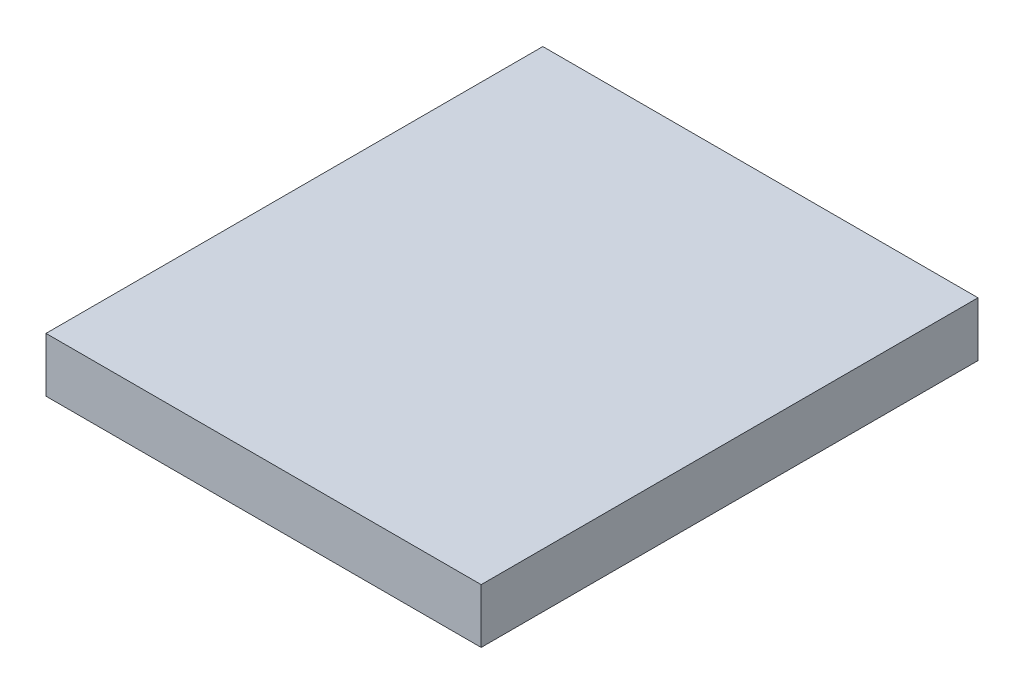
ISO-10303-21;
HEADER;
FILE_DESCRIPTION(('STEP AP214'),'2;1');
FILE_NAME('part.step','',(''),(''),'','','');
FILE_SCHEMA(('AUTOMOTIVE_DESIGN { 1 0 10303 214 1 1 1 1 }'));
ENDSEC;
DATA;
#1=APPLICATION_CONTEXT('core data for automotive mechanical design processes');
#2=APPLICATION_PROTOCOL_DEFINITION('international standard','automotive_design',2000,#1);
#3=PRODUCT_CONTEXT('',#1,'mechanical');
#4=PRODUCT('Part','Part','',(#3));
#5=PRODUCT_RELATED_PRODUCT_CATEGORY('part','',(#4));
#6=PRODUCT_DEFINITION_FORMATION('','',#4);
#7=PRODUCT_DEFINITION_CONTEXT('part definition',#1,'design');
#8=PRODUCT_DEFINITION('design','',#6,#7);
#9=PRODUCT_DEFINITION_SHAPE('','',#8);
#10=(LENGTH_UNIT() NAMED_UNIT(*) SI_UNIT(.MILLI.,.METRE.));
#11=(NAMED_UNIT(*) PLANE_ANGLE_UNIT() SI_UNIT($,.RADIAN.));
#12=(NAMED_UNIT(*) SI_UNIT($,.STERADIAN.) SOLID_ANGLE_UNIT());
#13=UNCERTAINTY_MEASURE_WITH_UNIT(LENGTH_MEASURE(1.E-05),#10,'distance_accuracy_value','');
#14=(GEOMETRIC_REPRESENTATION_CONTEXT(3) GLOBAL_UNCERTAINTY_ASSIGNED_CONTEXT((#13)) GLOBAL_UNIT_ASSIGNED_CONTEXT((#10,
#11,#12)) REPRESENTATION_CONTEXT('',''));
#15=CARTESIAN_POINT('',(0.,0.,0.));
#16=DIRECTION('',(0.,0.,1.));
#17=DIRECTION('',(1.,0.,0.));
#18=AXIS2_PLACEMENT_3D('',#15,#16,#17);
#19=CARTESIAN_POINT('',(-8.05761500973478,-2.,5.85297313234565));
#20=DIRECTION('',(-1.,0.,0.));
#21=DIRECTION('',(0.,0.,1.));
#22=AXIS2_PLACEMENT_3D('',#19,#20,#21);
#23=PLANE('',#22);
#24=DIRECTION('',(0.,1.,0.));
#25=VECTOR('',#24,1.);
#26=CARTESIAN_POINT('',(-8.05761500973478,-2.,5.85297313234565));
#27=LINE('',#26,#25);
#28=CARTESIAN_POINT('',(-8.05761500973478,-2.,5.85297313234565));
#29=VERTEX_POINT('',#28);
#30=CARTESIAN_POINT('',(-8.05761500973478,11.,5.85297313234565));
#31=VERTEX_POINT('',#30);
#32=EDGE_CURVE('E44',#29,#31,#27,.T.);
#33=ORIENTED_EDGE('',*,*,#32,.T.);
#34=DIRECTION('',(0.,0.,1.));
#35=VECTOR('',#34,1.);
#36=CARTESIAN_POINT('',(-8.05761500973478,11.,5.85297313234565));
#37=LINE('',#36,#35);
#38=CARTESIAN_POINT('',(-8.05761500973479,11.,-112.805484666262));
#39=VERTEX_POINT('',#38);
#40=EDGE_CURVE('E82',#39,#31,#37,.T.);
#41=ORIENTED_EDGE('',*,*,#40,.F.);
#42=DIRECTION('',(0.,1.,0.));
#43=VECTOR('',#42,1.);
#44=CARTESIAN_POINT('',(-8.05761500973479,-2.,-112.805484666262));
#45=LINE('',#44,#43);
#46=CARTESIAN_POINT('',(-8.05761500973479,-2.,-112.805484666262));
#47=VERTEX_POINT('',#46);
#48=EDGE_CURVE('E11',#47,#39,#45,.T.);
#49=ORIENTED_EDGE('',*,*,#48,.F.);
#50=DIRECTION('',(0.,0.,1.));
#51=VECTOR('',#50,1.);
#52=CARTESIAN_POINT('',(-8.05761500973478,-2.,5.85297313234565));
#53=LINE('',#52,#51);
#54=EDGE_CURVE('E83',#47,#29,#53,.T.);
#55=ORIENTED_EDGE('',*,*,#54,.T.);
#56=EDGE_LOOP('',(#33,#41,#49,#55));
#57=FACE_BOUND('',#56,.T.);
#58=ADVANCED_FACE('F41',(#57),#23,.T.);
#59=CARTESIAN_POINT('',(-8.05761500973479,-2.,-112.805484666262));
#60=DIRECTION('',(0.,0.,-1.));
#61=DIRECTION('',(-1.,0.,0.));
#62=AXIS2_PLACEMENT_3D('',#59,#60,#61);
#63=PLANE('',#62);
#64=ORIENTED_EDGE('',*,*,#48,.T.);
#65=DIRECTION('',(-1.,0.,0.));
#66=VECTOR('',#65,1.);
#67=CARTESIAN_POINT('',(-8.05761500973479,11.,-112.805484666262));
#68=LINE('',#67,#66);
#69=CARTESIAN_POINT('',(95.8734913752758,11.,-112.805484666262));
#70=VERTEX_POINT('',#69);
#71=EDGE_CURVE('E101',#70,#39,#68,.T.);
#72=ORIENTED_EDGE('',*,*,#71,.F.);
#73=DIRECTION('',(0.,1.,0.));
#74=VECTOR('',#73,1.);
#75=CARTESIAN_POINT('',(95.8734913752758,-2.,-112.805484666262));
#76=LINE('',#75,#74);
#77=CARTESIAN_POINT('',(95.8734913752758,-2.,-112.805484666262));
#78=VERTEX_POINT('',#77);
#79=EDGE_CURVE('E50',#78,#70,#76,.T.);
#80=ORIENTED_EDGE('',*,*,#79,.F.);
#81=DIRECTION('',(-1.,0.,0.));
#82=VECTOR('',#81,1.);
#83=CARTESIAN_POINT('',(-8.05761500973479,-2.,-112.805484666262));
#84=LINE('',#83,#82);
#85=EDGE_CURVE('E89',#78,#47,#84,.T.);
#86=ORIENTED_EDGE('',*,*,#85,.T.);
#87=EDGE_LOOP('',(#64,#72,#80,#86));
#88=FACE_BOUND('',#87,.T.);
#89=ADVANCED_FACE('F125',(#88),#63,.T.);
#90=CARTESIAN_POINT('',(95.8734913752759,-2.,5.85297313234564));
#91=DIRECTION('',(1.,0.,0.));
#92=DIRECTION('',(0.,0.,-1.));
#93=AXIS2_PLACEMENT_3D('',#90,#91,#92);
#94=PLANE('',#93);
#95=ORIENTED_EDGE('',*,*,#79,.T.);
#96=DIRECTION('',(0.,0.,-1.));
#97=VECTOR('',#96,1.);
#98=CARTESIAN_POINT('',(95.8734913752759,11.,5.85297313234564));
#99=LINE('',#98,#97);
#100=CARTESIAN_POINT('',(95.8734913752759,11.,5.85297313234564));
#101=VERTEX_POINT('',#100);
#102=EDGE_CURVE('E97',#101,#70,#99,.T.);
#103=ORIENTED_EDGE('',*,*,#102,.F.);
#104=DIRECTION('',(0.,1.,0.));
#105=VECTOR('',#104,1.);
#106=CARTESIAN_POINT('',(95.8734913752759,-2.,5.85297313234564));
#107=LINE('',#106,#105);
#108=CARTESIAN_POINT('',(95.8734913752759,-2.,5.85297313234564));
#109=VERTEX_POINT('',#108);
#110=EDGE_CURVE('E88',#109,#101,#107,.T.);
#111=ORIENTED_EDGE('',*,*,#110,.F.);
#112=DIRECTION('',(0.,0.,-1.));
#113=VECTOR('',#112,1.);
#114=CARTESIAN_POINT('',(95.8734913752759,-2.,5.85297313234564));
#115=LINE('',#114,#113);
#116=EDGE_CURVE('E114',#109,#78,#115,.T.);
#117=ORIENTED_EDGE('',*,*,#116,.T.);
#118=EDGE_LOOP('',(#95,#103,#111,#117));
#119=FACE_BOUND('',#118,.T.);
#120=ADVANCED_FACE('F122',(#119),#94,.T.);
#121=CARTESIAN_POINT('',(-8.05761500973478,-2.,5.85297313234565));
#122=DIRECTION('',(0.,0.,1.));
#123=DIRECTION('',(1.,0.,0.));
#124=AXIS2_PLACEMENT_3D('',#121,#122,#123);
#125=PLANE('',#124);
#126=ORIENTED_EDGE('',*,*,#110,.T.);
#127=DIRECTION('',(1.,0.,0.));
#128=VECTOR('',#127,1.);
#129=CARTESIAN_POINT('',(-8.05761500973478,11.,5.85297313234565));
#130=LINE('',#129,#128);
#131=EDGE_CURVE('E91',#31,#101,#130,.T.);
#132=ORIENTED_EDGE('',*,*,#131,.F.);
#133=ORIENTED_EDGE('',*,*,#32,.F.);
#134=DIRECTION('',(1.,0.,0.));
#135=VECTOR('',#134,1.);
#136=CARTESIAN_POINT('',(-8.05761500973478,-2.,5.85297313234565));
#137=LINE('',#136,#135);
#138=EDGE_CURVE('E111',#29,#109,#137,.T.);
#139=ORIENTED_EDGE('',*,*,#138,.T.);
#140=EDGE_LOOP('',(#126,#132,#133,#139));
#141=FACE_BOUND('',#140,.T.);
#142=ADVANCED_FACE('F92',(#141),#125,.T.);
#143=CARTESIAN_POINT('',(0.,-2.,0.));
#144=DIRECTION('',(0.,-1.,0.));
#145=DIRECTION('',(0.,0.,-1.));
#146=AXIS2_PLACEMENT_3D('',#143,#144,#145);
#147=PLANE('',#146);
#148=ORIENTED_EDGE('',*,*,#54,.F.);
#149=ORIENTED_EDGE('',*,*,#85,.F.);
#150=ORIENTED_EDGE('',*,*,#116,.F.);
#151=ORIENTED_EDGE('',*,*,#138,.F.);
#152=EDGE_LOOP('',(#148,#149,#150,#151));
#153=FACE_BOUND('',#152,.T.);
#154=ADVANCED_FACE('F127',(#153),#147,.T.);
#155=CARTESIAN_POINT('',(0.,11.,0.));
#156=DIRECTION('',(0.,-1.,0.));
#157=DIRECTION('',(0.,0.,-1.));
#158=AXIS2_PLACEMENT_3D('',#155,#156,#157);
#159=PLANE('',#158);
#160=ORIENTED_EDGE('',*,*,#40,.T.);
#161=ORIENTED_EDGE('',*,*,#131,.T.);
#162=ORIENTED_EDGE('',*,*,#102,.T.);
#163=ORIENTED_EDGE('',*,*,#71,.T.);
#164=EDGE_LOOP('',(#160,#161,#162,#163));
#165=FACE_BOUND('',#164,.T.);
#166=ADVANCED_FACE('F100',(#165),#159,.F.);
#167=CLOSED_SHELL('',(#58,#89,#120,#142,#154,#166));
#168=MANIFOLD_SOLID_BREP('B2',#167);
#169=ADVANCED_BREP_SHAPE_REPRESENTATION('',(#18,#168),#14);
#170=SHAPE_DEFINITION_REPRESENTATION(#9,#169);
ENDSEC;
END-ISO-10303-21;
